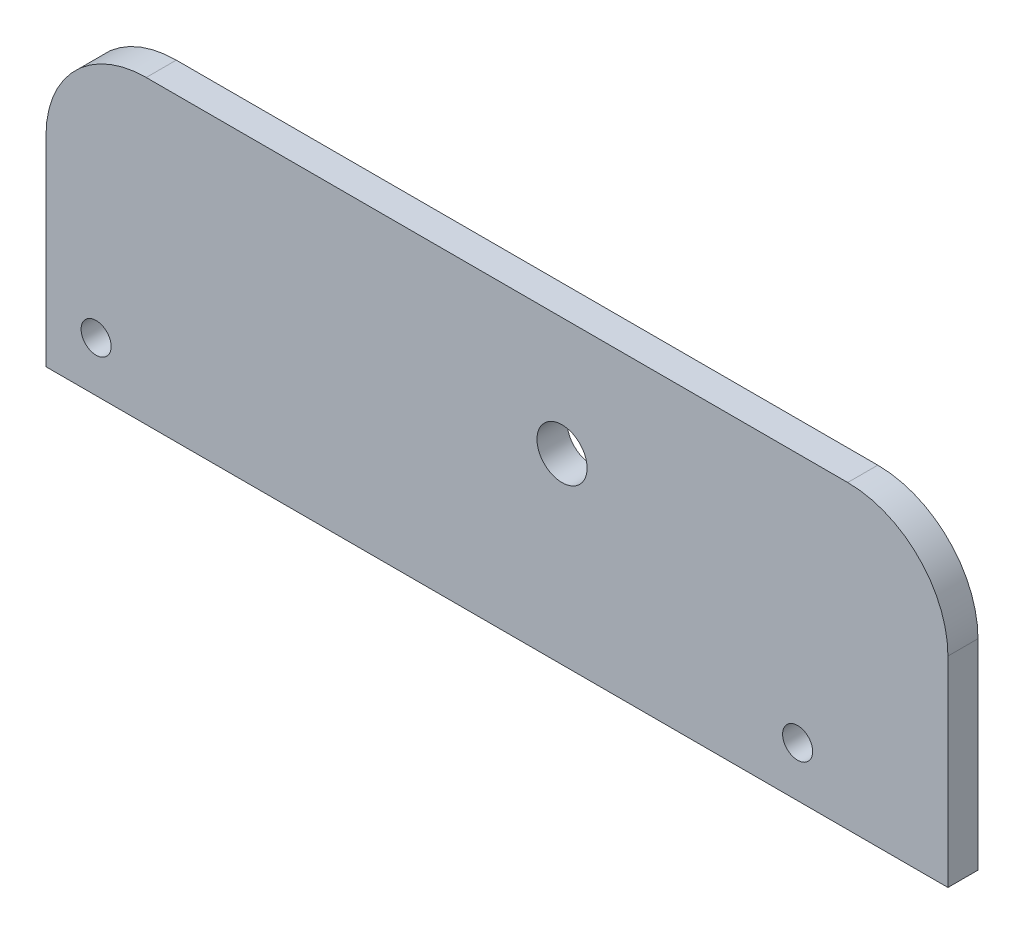
ISO-10303-21;
HEADER;
FILE_DESCRIPTION(('STEP AP214'),'2;1');
FILE_NAME('part.step','',(''),(''),'','','');
FILE_SCHEMA(('AUTOMOTIVE_DESIGN { 1 0 10303 214 1 1 1 1 }'));
ENDSEC;
DATA;
#1=APPLICATION_CONTEXT('core data for automotive mechanical design processes');
#2=APPLICATION_PROTOCOL_DEFINITION('international standard','automotive_design',2000,#1);
#3=PRODUCT_CONTEXT('',#1,'mechanical');
#4=PRODUCT('Part','Part','',(#3));
#5=PRODUCT_RELATED_PRODUCT_CATEGORY('part','',(#4));
#6=PRODUCT_DEFINITION_FORMATION('','',#4);
#7=PRODUCT_DEFINITION_CONTEXT('part definition',#1,'design');
#8=PRODUCT_DEFINITION('design','',#6,#7);
#9=PRODUCT_DEFINITION_SHAPE('','',#8);
#10=(LENGTH_UNIT() NAMED_UNIT(*) SI_UNIT(.MILLI.,.METRE.));
#11=(NAMED_UNIT(*) PLANE_ANGLE_UNIT() SI_UNIT($,.RADIAN.));
#12=(NAMED_UNIT(*) SI_UNIT($,.STERADIAN.) SOLID_ANGLE_UNIT());
#13=UNCERTAINTY_MEASURE_WITH_UNIT(LENGTH_MEASURE(1.E-05),#10,'distance_accuracy_value','');
#14=(GEOMETRIC_REPRESENTATION_CONTEXT(3) GLOBAL_UNCERTAINTY_ASSIGNED_CONTEXT((#13)) GLOBAL_UNIT_ASSIGNED_CONTEXT((#10,
#11,#12)) REPRESENTATION_CONTEXT('',''));
#15=CARTESIAN_POINT('',(0.,0.,0.));
#16=DIRECTION('',(0.,0.,1.));
#17=DIRECTION('',(1.,0.,0.));
#18=AXIS2_PLACEMENT_3D('',#15,#16,#17);
#19=CARTESIAN_POINT('',(45.,15.,3.));
#20=DIRECTION('',(-1.,0.,0.));
#21=DIRECTION('',(0.,0.,1.));
#22=AXIS2_PLACEMENT_3D('',#19,#20,#21);
#23=PLANE('',#22);
#24=DIRECTION('',(0.,1.,0.));
#25=VECTOR('',#24,1.);
#26=CARTESIAN_POINT('',(45.,15.,0.));
#27=LINE('',#26,#25);
#28=CARTESIAN_POINT('',(45.,-15.,0.));
#29=VERTEX_POINT('',#28);
#30=CARTESIAN_POINT('',(45.,5.,0.));
#31=VERTEX_POINT('',#30);
#32=EDGE_CURVE('E125',#29,#31,#27,.T.);
#33=ORIENTED_EDGE('',*,*,#32,.T.);
#34=DIRECTION('',(0.,0.,-1.));
#35=VECTOR('',#34,1.);
#36=CARTESIAN_POINT('',(45.,5.,3.));
#37=LINE('',#36,#35);
#38=CARTESIAN_POINT('',(45.,5.,3.));
#39=VERTEX_POINT('',#38);
#40=EDGE_CURVE('E11',#31,#39,#37,.F.);
#41=ORIENTED_EDGE('',*,*,#40,.T.);
#42=DIRECTION('',(0.,1.,0.));
#43=VECTOR('',#42,1.);
#44=CARTESIAN_POINT('',(45.,15.,3.));
#45=LINE('',#44,#43);
#46=CARTESIAN_POINT('',(45.,-15.,3.));
#47=VERTEX_POINT('',#46);
#48=EDGE_CURVE('E136',#47,#39,#45,.T.);
#49=ORIENTED_EDGE('',*,*,#48,.F.);
#50=DIRECTION('',(0.,0.,-1.));
#51=VECTOR('',#50,1.);
#52=CARTESIAN_POINT('',(45.,-15.,3.));
#53=LINE('',#52,#51);
#54=EDGE_CURVE('E115',#47,#29,#53,.T.);
#55=ORIENTED_EDGE('',*,*,#54,.T.);
#56=EDGE_LOOP('',(#33,#41,#49,#55));
#57=FACE_BOUND('',#56,.T.);
#58=ADVANCED_FACE('F38',(#57),#23,.F.);
#59=CARTESIAN_POINT('',(-45.,15.,3.));
#60=DIRECTION('',(0.,-1.,0.));
#61=DIRECTION('',(0.,0.,-1.));
#62=AXIS2_PLACEMENT_3D('',#59,#60,#61);
#63=PLANE('',#62);
#64=DIRECTION('',(-1.,0.,0.));
#65=VECTOR('',#64,1.);
#66=CARTESIAN_POINT('',(-45.,15.,0.));
#67=LINE('',#66,#65);
#68=CARTESIAN_POINT('',(35.,15.,0.));
#69=VERTEX_POINT('',#68);
#70=CARTESIAN_POINT('',(-35.,15.,0.));
#71=VERTEX_POINT('',#70);
#72=EDGE_CURVE('E128',#69,#71,#67,.T.);
#73=ORIENTED_EDGE('',*,*,#72,.T.);
#74=DIRECTION('',(0.,0.,-1.));
#75=VECTOR('',#74,1.);
#76=CARTESIAN_POINT('',(-35.,15.,3.));
#77=LINE('',#76,#75);
#78=CARTESIAN_POINT('',(-35.,15.,3.));
#79=VERTEX_POINT('',#78);
#80=EDGE_CURVE('E60',#71,#79,#77,.F.);
#81=ORIENTED_EDGE('',*,*,#80,.T.);
#82=DIRECTION('',(-1.,0.,0.));
#83=VECTOR('',#82,1.);
#84=CARTESIAN_POINT('',(-45.,15.,3.));
#85=LINE('',#84,#83);
#86=CARTESIAN_POINT('',(35.,15.,3.));
#87=VERTEX_POINT('',#86);
#88=EDGE_CURVE('E104',#87,#79,#85,.T.);
#89=ORIENTED_EDGE('',*,*,#88,.F.);
#90=DIRECTION('',(0.,0.,-1.));
#91=VECTOR('',#90,1.);
#92=CARTESIAN_POINT('',(35.,15.,3.));
#93=LINE('',#92,#91);
#94=EDGE_CURVE('E160',#87,#69,#93,.T.);
#95=ORIENTED_EDGE('',*,*,#94,.T.);
#96=EDGE_LOOP('',(#73,#81,#89,#95));
#97=FACE_BOUND('',#96,.T.);
#98=ADVANCED_FACE('F172',(#97),#63,.F.);
#99=CARTESIAN_POINT('',(-45.,15.,3.));
#100=DIRECTION('',(1.,0.,0.));
#101=DIRECTION('',(0.,0.,-1.));
#102=AXIS2_PLACEMENT_3D('',#99,#100,#101);
#103=PLANE('',#102);
#104=DIRECTION('',(0.,-1.,0.));
#105=VECTOR('',#104,1.);
#106=CARTESIAN_POINT('',(-45.,15.,3.));
#107=LINE('',#106,#105);
#108=CARTESIAN_POINT('',(-45.,5.,3.));
#109=VERTEX_POINT('',#108);
#110=CARTESIAN_POINT('',(-45.,-15.,3.));
#111=VERTEX_POINT('',#110);
#112=EDGE_CURVE('E93',#109,#111,#107,.T.);
#113=ORIENTED_EDGE('',*,*,#112,.F.);
#114=DIRECTION('',(0.,0.,-1.));
#115=VECTOR('',#114,1.);
#116=CARTESIAN_POINT('',(-45.,5.,3.));
#117=LINE('',#116,#115);
#118=CARTESIAN_POINT('',(-45.,5.,0.));
#119=VERTEX_POINT('',#118);
#120=EDGE_CURVE('E114',#109,#119,#117,.T.);
#121=ORIENTED_EDGE('',*,*,#120,.T.);
#122=DIRECTION('',(0.,-1.,0.));
#123=VECTOR('',#122,1.);
#124=CARTESIAN_POINT('',(-45.,15.,0.));
#125=LINE('',#124,#123);
#126=CARTESIAN_POINT('',(-45.,-15.,0.));
#127=VERTEX_POINT('',#126);
#128=EDGE_CURVE('E110',#119,#127,#125,.T.);
#129=ORIENTED_EDGE('',*,*,#128,.T.);
#130=DIRECTION('',(0.,0.,-1.));
#131=VECTOR('',#130,1.);
#132=CARTESIAN_POINT('',(-45.,-15.,3.));
#133=LINE('',#132,#131);
#134=EDGE_CURVE('E107',#111,#127,#133,.T.);
#135=ORIENTED_EDGE('',*,*,#134,.F.);
#136=EDGE_LOOP('',(#113,#121,#129,#135));
#137=FACE_BOUND('',#136,.T.);
#138=ADVANCED_FACE('F108',(#137),#103,.F.);
#139=CARTESIAN_POINT('',(-45.,-15.,3.));
#140=DIRECTION('',(0.,1.,0.));
#141=DIRECTION('',(0.,0.,1.));
#142=AXIS2_PLACEMENT_3D('',#139,#140,#141);
#143=PLANE('',#142);
#144=DIRECTION('',(1.,0.,0.));
#145=VECTOR('',#144,1.);
#146=CARTESIAN_POINT('',(-45.,-15.,0.));
#147=LINE('',#146,#145);
#148=EDGE_CURVE('E134',#127,#29,#147,.T.);
#149=ORIENTED_EDGE('',*,*,#148,.T.);
#150=ORIENTED_EDGE('',*,*,#54,.F.);
#151=DIRECTION('',(1.,0.,0.));
#152=VECTOR('',#151,1.);
#153=CARTESIAN_POINT('',(-45.,-15.,3.));
#154=LINE('',#153,#152);
#155=EDGE_CURVE('E97',#111,#47,#154,.T.);
#156=ORIENTED_EDGE('',*,*,#155,.F.);
#157=ORIENTED_EDGE('',*,*,#134,.T.);
#158=EDGE_LOOP('',(#149,#150,#156,#157));
#159=FACE_BOUND('',#158,.T.);
#160=ADVANCED_FACE('F117',(#159),#143,.F.);
#161=CARTESIAN_POINT('',(0.,0.,3.));
#162=DIRECTION('',(0.,0.,1.));
#163=DIRECTION('',(1.,0.,0.));
#164=AXIS2_PLACEMENT_3D('',#161,#162,#163);
#165=PLANE('',#164);
#166=CARTESIAN_POINT('',(30.0000000000006,-9.99999999999995,3.));
#167=DIRECTION('',(0.,0.,1.));
#168=DIRECTION('',(1.,0.,0.));
#169=AXIS2_PLACEMENT_3D('',#166,#167,#168);
#170=CIRCLE('',#169,1.49999999999961);
#171=CARTESIAN_POINT('',(31.5000000000002,-9.99999999999995,3.));
#172=VERTEX_POINT('',#171);
#173=EDGE_CURVE('E151',#172,#172,#170,.T.);
#174=ORIENTED_EDGE('',*,*,#173,.F.);
#175=EDGE_LOOP('',(#174));
#176=FACE_BOUND('',#175,.T.);
#177=CARTESIAN_POINT('',(-39.9999999999995,-10.0000000000001,3.));
#178=DIRECTION('',(0.,0.,1.));
#179=DIRECTION('',(1.,0.,0.));
#180=AXIS2_PLACEMENT_3D('',#177,#178,#179);
#181=CIRCLE('',#180,1.49999999999977);
#182=CARTESIAN_POINT('',(-38.4999999999998,-10.0000000000001,3.));
#183=VERTEX_POINT('',#182);
#184=EDGE_CURVE('E146',#183,#183,#181,.T.);
#185=ORIENTED_EDGE('',*,*,#184,.F.);
#186=EDGE_LOOP('',(#185));
#187=FACE_BOUND('',#186,.T.);
#188=CARTESIAN_POINT('',(6.49227101980931,3.23696710576318,3.));
#189=DIRECTION('',(0.,0.,1.));
#190=DIRECTION('',(1.,0.,0.));
#191=AXIS2_PLACEMENT_3D('',#188,#189,#190);
#192=CIRCLE('',#191,2.5);
#193=CARTESIAN_POINT('',(8.99227101980932,3.23696710576318,3.));
#194=VERTEX_POINT('',#193);
#195=EDGE_CURVE('E141',#194,#194,#192,.T.);
#196=ORIENTED_EDGE('',*,*,#195,.F.);
#197=EDGE_LOOP('',(#196));
#198=FACE_BOUND('',#197,.T.);
#199=ORIENTED_EDGE('',*,*,#88,.T.);
#200=CARTESIAN_POINT('',(-35.,5.,3.));
#201=DIRECTION('',(0.,0.,1.));
#202=DIRECTION('',(1.,0.,0.));
#203=AXIS2_PLACEMENT_3D('',#200,#201,#202);
#204=CIRCLE('',#203,10.);
#205=EDGE_CURVE('E47',#79,#109,#204,.T.);
#206=ORIENTED_EDGE('',*,*,#205,.T.);
#207=ORIENTED_EDGE('',*,*,#112,.T.);
#208=ORIENTED_EDGE('',*,*,#155,.T.);
#209=ORIENTED_EDGE('',*,*,#48,.T.);
#210=CARTESIAN_POINT('',(35.,5.,3.));
#211=DIRECTION('',(0.,0.,1.));
#212=DIRECTION('',(1.,0.,0.));
#213=AXIS2_PLACEMENT_3D('',#210,#211,#212);
#214=CIRCLE('',#213,10.);
#215=EDGE_CURVE('E166',#39,#87,#214,.T.);
#216=ORIENTED_EDGE('',*,*,#215,.T.);
#217=EDGE_LOOP('',(#199,#206,#207,#208,#209,#216));
#218=FACE_BOUND('',#217,.T.);
#219=ADVANCED_FACE('F95',(#176,#187,#198,#218),#165,.T.);
#220=CARTESIAN_POINT('',(0.,0.,0.));
#221=DIRECTION('',(0.,0.,1.));
#222=DIRECTION('',(1.,0.,0.));
#223=AXIS2_PLACEMENT_3D('',#220,#221,#222);
#224=PLANE('',#223);
#225=CARTESIAN_POINT('',(30.0000000000006,-9.99999999999995,0.));
#226=DIRECTION('',(0.,0.,1.));
#227=DIRECTION('',(1.,0.,0.));
#228=AXIS2_PLACEMENT_3D('',#225,#226,#227);
#229=CIRCLE('',#228,1.49999999999961);
#230=CARTESIAN_POINT('',(31.5000000000002,-9.99999999999995,0.));
#231=VERTEX_POINT('',#230);
#232=EDGE_CURVE('E147',#231,#231,#229,.T.);
#233=ORIENTED_EDGE('',*,*,#232,.T.);
#234=EDGE_LOOP('',(#233));
#235=FACE_BOUND('',#234,.T.);
#236=CARTESIAN_POINT('',(-39.9999999999995,-10.0000000000001,0.));
#237=DIRECTION('',(0.,0.,1.));
#238=DIRECTION('',(1.,0.,0.));
#239=AXIS2_PLACEMENT_3D('',#236,#237,#238);
#240=CIRCLE('',#239,1.49999999999977);
#241=CARTESIAN_POINT('',(-38.4999999999998,-10.0000000000001,0.));
#242=VERTEX_POINT('',#241);
#243=EDGE_CURVE('E142',#242,#242,#240,.T.);
#244=ORIENTED_EDGE('',*,*,#243,.T.);
#245=EDGE_LOOP('',(#244));
#246=FACE_BOUND('',#245,.T.);
#247=CARTESIAN_POINT('',(6.49227101980931,3.23696710576318,0.));
#248=DIRECTION('',(0.,0.,1.));
#249=DIRECTION('',(1.,0.,0.));
#250=AXIS2_PLACEMENT_3D('',#247,#248,#249);
#251=CIRCLE('',#250,2.5);
#252=CARTESIAN_POINT('',(8.99227101980932,3.23696710576318,0.));
#253=VERTEX_POINT('',#252);
#254=EDGE_CURVE('E129',#253,#253,#251,.T.);
#255=ORIENTED_EDGE('',*,*,#254,.T.);
#256=EDGE_LOOP('',(#255));
#257=FACE_BOUND('',#256,.T.);
#258=ORIENTED_EDGE('',*,*,#128,.F.);
#259=CARTESIAN_POINT('',(-35.,5.,0.));
#260=DIRECTION('',(0.,0.,1.));
#261=DIRECTION('',(1.,0.,0.));
#262=AXIS2_PLACEMENT_3D('',#259,#260,#261);
#263=CIRCLE('',#262,10.);
#264=EDGE_CURVE('E157',#119,#71,#263,.F.);
#265=ORIENTED_EDGE('',*,*,#264,.T.);
#266=ORIENTED_EDGE('',*,*,#72,.F.);
#267=CARTESIAN_POINT('',(35.,5.,0.));
#268=DIRECTION('',(0.,0.,1.));
#269=DIRECTION('',(1.,0.,0.));
#270=AXIS2_PLACEMENT_3D('',#267,#268,#269);
#271=CIRCLE('',#270,10.);
#272=EDGE_CURVE('E154',#69,#31,#271,.F.);
#273=ORIENTED_EDGE('',*,*,#272,.T.);
#274=ORIENTED_EDGE('',*,*,#32,.F.);
#275=ORIENTED_EDGE('',*,*,#148,.F.);
#276=EDGE_LOOP('',(#258,#265,#266,#273,#274,#275));
#277=FACE_BOUND('',#276,.T.);
#278=ADVANCED_FACE('F177',(#235,#246,#257,#277),#224,.F.);
#279=CARTESIAN_POINT('',(6.49227101980931,3.23696710576318,-7.));
#280=DIRECTION('',(0.,0.,1.));
#281=DIRECTION('',(1.,0.,0.));
#282=AXIS2_PLACEMENT_3D('',#279,#280,#281);
#283=CYLINDRICAL_SURFACE('',#282,2.5);
#284=ORIENTED_EDGE('',*,*,#195,.T.);
#285=EDGE_LOOP('',(#284));
#286=FACE_BOUND('',#285,.T.);
#287=ORIENTED_EDGE('',*,*,#254,.F.);
#288=EDGE_LOOP('',(#287));
#289=FACE_BOUND('',#288,.T.);
#290=ADVANCED_FACE('F201',(#286,#289),#283,.F.);
#291=CARTESIAN_POINT('',(-39.9999999999995,-10.0000000000001,-7.));
#292=DIRECTION('',(0.,0.,1.));
#293=DIRECTION('',(1.,0.,0.));
#294=AXIS2_PLACEMENT_3D('',#291,#292,#293);
#295=CYLINDRICAL_SURFACE('',#294,1.49999999999977);
#296=ORIENTED_EDGE('',*,*,#184,.T.);
#297=EDGE_LOOP('',(#296));
#298=FACE_BOUND('',#297,.T.);
#299=ORIENTED_EDGE('',*,*,#243,.F.);
#300=EDGE_LOOP('',(#299));
#301=FACE_BOUND('',#300,.T.);
#302=ADVANCED_FACE('F204',(#298,#301),#295,.F.);
#303=CARTESIAN_POINT('',(30.0000000000006,-9.99999999999995,-7.));
#304=DIRECTION('',(0.,0.,1.));
#305=DIRECTION('',(1.,0.,0.));
#306=AXIS2_PLACEMENT_3D('',#303,#304,#305);
#307=CYLINDRICAL_SURFACE('',#306,1.49999999999961);
#308=ORIENTED_EDGE('',*,*,#173,.T.);
#309=EDGE_LOOP('',(#308));
#310=FACE_BOUND('',#309,.T.);
#311=ORIENTED_EDGE('',*,*,#232,.F.);
#312=EDGE_LOOP('',(#311));
#313=FACE_BOUND('',#312,.T.);
#314=ADVANCED_FACE('F191',(#310,#313),#307,.F.);
#315=CARTESIAN_POINT('',(-35.,5.,3.));
#316=DIRECTION('',(0.,0.,-1.));
#317=DIRECTION('',(-1.,0.,0.));
#318=AXIS2_PLACEMENT_3D('',#315,#316,#317);
#319=CYLINDRICAL_SURFACE('',#318,10.);
#320=ORIENTED_EDGE('',*,*,#205,.F.);
#321=ORIENTED_EDGE('',*,*,#80,.F.);
#322=ORIENTED_EDGE('',*,*,#264,.F.);
#323=ORIENTED_EDGE('',*,*,#120,.F.);
#324=EDGE_LOOP('',(#320,#321,#322,#323));
#325=FACE_BOUND('',#324,.T.);
#326=ADVANCED_FACE('F224',(#325),#319,.T.);
#327=CARTESIAN_POINT('',(35.,5.,3.));
#328=DIRECTION('',(0.,0.,-1.));
#329=DIRECTION('',(-1.,0.,0.));
#330=AXIS2_PLACEMENT_3D('',#327,#328,#329);
#331=CYLINDRICAL_SURFACE('',#330,10.);
#332=ORIENTED_EDGE('',*,*,#215,.F.);
#333=ORIENTED_EDGE('',*,*,#40,.F.);
#334=ORIENTED_EDGE('',*,*,#272,.F.);
#335=ORIENTED_EDGE('',*,*,#94,.F.);
#336=EDGE_LOOP('',(#332,#333,#334,#335));
#337=FACE_BOUND('',#336,.T.);
#338=ADVANCED_FACE('F40',(#337),#331,.T.);
#339=CLOSED_SHELL('',(#58,#98,#138,#160,#219,#278,#290,#302,#314,#326,#338));
#340=MANIFOLD_SOLID_BREP('B2',#339);
#341=ADVANCED_BREP_SHAPE_REPRESENTATION('',(#18,#340),#14);
#342=SHAPE_DEFINITION_REPRESENTATION(#9,#341);
ENDSEC;
END-ISO-10303-21;
